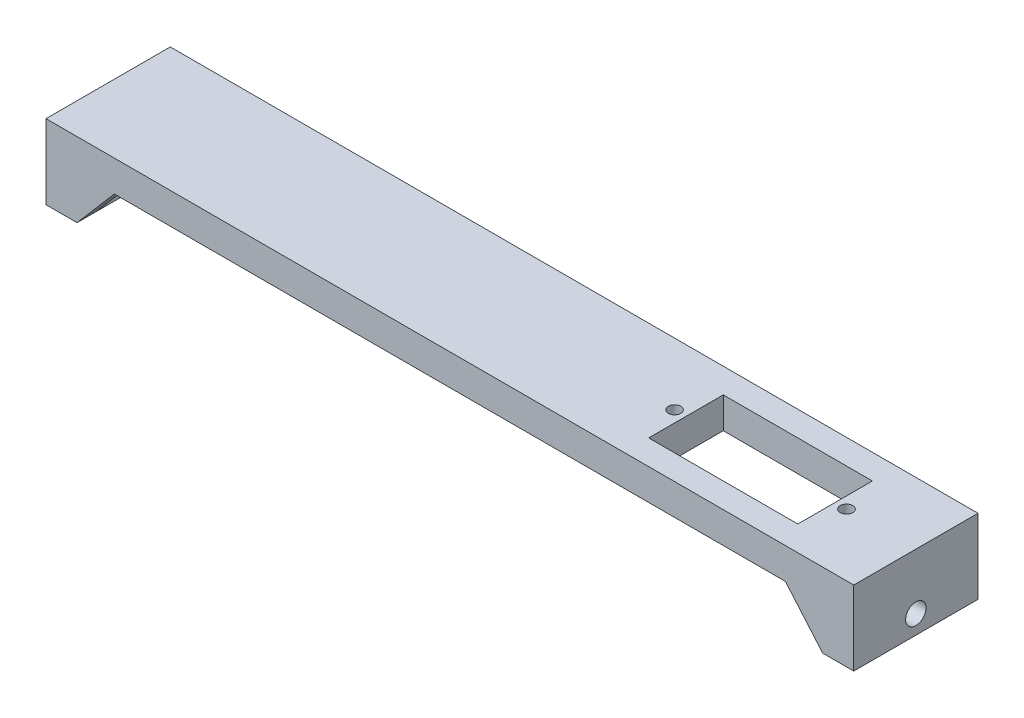
ISO-10303-21;
HEADER;
FILE_DESCRIPTION(('STEP AP214'),'2;1');
FILE_NAME('part.step','',(''),(''),'','','');
FILE_SCHEMA(('AUTOMOTIVE_DESIGN { 1 0 10303 214 1 1 1 1 }'));
ENDSEC;
DATA;
#1=APPLICATION_CONTEXT('core data for automotive mechanical design processes');
#2=APPLICATION_PROTOCOL_DEFINITION('international standard','automotive_design',2000,#1);
#3=PRODUCT_CONTEXT('',#1,'mechanical');
#4=PRODUCT('Part','Part','',(#3));
#5=PRODUCT_RELATED_PRODUCT_CATEGORY('part','',(#4));
#6=PRODUCT_DEFINITION_FORMATION('','',#4);
#7=PRODUCT_DEFINITION_CONTEXT('part definition',#1,'design');
#8=PRODUCT_DEFINITION('design','',#6,#7);
#9=PRODUCT_DEFINITION_SHAPE('','',#8);
#10=(LENGTH_UNIT() NAMED_UNIT(*) SI_UNIT(.MILLI.,.METRE.));
#11=(NAMED_UNIT(*) PLANE_ANGLE_UNIT() SI_UNIT($,.RADIAN.));
#12=(NAMED_UNIT(*) SI_UNIT($,.STERADIAN.) SOLID_ANGLE_UNIT());
#13=UNCERTAINTY_MEASURE_WITH_UNIT(LENGTH_MEASURE(1.E-05),#10,'distance_accuracy_value','');
#14=(GEOMETRIC_REPRESENTATION_CONTEXT(3) GLOBAL_UNCERTAINTY_ASSIGNED_CONTEXT((#13)) GLOBAL_UNIT_ASSIGNED_CONTEXT((#10,
#11,#12)) REPRESENTATION_CONTEXT('',''));
#15=CARTESIAN_POINT('',(0.,0.,0.));
#16=DIRECTION('',(0.,0.,1.));
#17=DIRECTION('',(1.,0.,0.));
#18=AXIS2_PLACEMENT_3D('',#15,#16,#17);
#19=CARTESIAN_POINT('',(60.,-5.00000000000001,20.));
#20=DIRECTION('',(0.,1.,0.));
#21=DIRECTION('',(0.,0.,1.));
#22=AXIS2_PLACEMENT_3D('',#19,#20,#21);
#23=PLANE('',#22);
#24=CARTESIAN_POINT('',(53.835,-5.00000000000001,10.));
#25=DIRECTION('',(0.,-1.,0.));
#26=DIRECTION('',(0.,0.,-1.));
#27=AXIS2_PLACEMENT_3D('',#24,#25,#26);
#28=CIRCLE('',#27,0.999999999999998);
#29=CARTESIAN_POINT('',(53.835,-5.00000000000001,9.));
#30=VERTEX_POINT('',#29);
#31=EDGE_CURVE('E679',#30,#30,#28,.T.);
#32=ORIENTED_EDGE('',*,*,#31,.F.);
#33=EDGE_LOOP('',(#32));
#34=FACE_BOUND('',#33,.T.);
#35=CARTESIAN_POINT('',(26.165,-5.00000000000001,10.));
#36=DIRECTION('',(0.,-1.,0.));
#37=DIRECTION('',(0.,0.,-1.));
#38=AXIS2_PLACEMENT_3D('',#35,#36,#37);
#39=CIRCLE('',#38,1.);
#40=CARTESIAN_POINT('',(26.165,-5.00000000000001,8.99999999999999));
#41=VERTEX_POINT('',#40);
#42=EDGE_CURVE('E193',#41,#41,#39,.T.);
#43=ORIENTED_EDGE('',*,*,#42,.F.);
#44=EDGE_LOOP('',(#43));
#45=FACE_BOUND('',#44,.T.);
#46=DIRECTION('',(-1.,0.,0.));
#47=VECTOR('',#46,1.);
#48=CARTESIAN_POINT('',(52.,-5.00000000000001,16.));
#49=LINE('',#48,#47);
#50=CARTESIAN_POINT('',(52.,-5.00000000000001,16.));
#51=VERTEX_POINT('',#50);
#52=CARTESIAN_POINT('',(28.,-5.00000000000001,16.));
#53=VERTEX_POINT('',#52);
#54=EDGE_CURVE('E202',#51,#53,#49,.T.);
#55=ORIENTED_EDGE('',*,*,#54,.F.);
#56=DIRECTION('',(0.,0.,1.));
#57=VECTOR('',#56,1.);
#58=CARTESIAN_POINT('',(52.,-5.00000000000001,4.));
#59=LINE('',#58,#57);
#60=CARTESIAN_POINT('',(52.,-5.00000000000001,4.));
#61=VERTEX_POINT('',#60);
#62=EDGE_CURVE('E57',#61,#51,#59,.T.);
#63=ORIENTED_EDGE('',*,*,#62,.F.);
#64=DIRECTION('',(-1.,0.,0.));
#65=VECTOR('',#64,1.);
#66=CARTESIAN_POINT('',(52.,-5.00000000000001,4.));
#67=LINE('',#66,#65);
#68=CARTESIAN_POINT('',(28.,-5.00000000000001,4.));
#69=VERTEX_POINT('',#68);
#70=EDGE_CURVE('E186',#61,#69,#67,.T.);
#71=ORIENTED_EDGE('',*,*,#70,.T.);
#72=DIRECTION('',(0.,0.,1.));
#73=VECTOR('',#72,1.);
#74=CARTESIAN_POINT('',(28.,-5.00000000000001,4.));
#75=LINE('',#74,#73);
#76=EDGE_CURVE('E190',#69,#53,#75,.T.);
#77=ORIENTED_EDGE('',*,*,#76,.T.);
#78=EDGE_LOOP('',(#55,#63,#71,#77));
#79=FACE_BOUND('',#78,.T.);
#80=DIRECTION('',(-1.,0.,0.));
#81=VECTOR('',#80,1.);
#82=CARTESIAN_POINT('',(54.,-5.00000000000001,17.));
#83=LINE('',#82,#81);
#84=CARTESIAN_POINT('',(60.,-5.00000000000001,17.));
#85=VERTEX_POINT('',#84);
#86=CARTESIAN_POINT('',(54.,-5.00000000000001,17.));
#87=VERTEX_POINT('',#86);
#88=EDGE_CURVE('E218',#85,#87,#83,.T.);
#89=ORIENTED_EDGE('',*,*,#88,.T.);
#90=DIRECTION('',(0.,0.,1.));
#91=VECTOR('',#90,1.);
#92=CARTESIAN_POINT('',(54.,-5.00000000000001,17.));
#93=LINE('',#92,#91);
#94=CARTESIAN_POINT('',(54.,-5.00000000000001,20.));
#95=VERTEX_POINT('',#94);
#96=EDGE_CURVE('E229',#87,#95,#93,.T.);
#97=ORIENTED_EDGE('',*,*,#96,.T.);
#98=DIRECTION('',(1.,0.,0.));
#99=VECTOR('',#98,1.);
#100=CARTESIAN_POINT('',(60.,-5.00000000000001,20.));
#101=LINE('',#100,#99);
#102=CARTESIAN_POINT('',(-54.,-5.00000000000001,20.));
#103=VERTEX_POINT('',#102);
#104=EDGE_CURVE('E324',#103,#95,#101,.T.);
#105=ORIENTED_EDGE('',*,*,#104,.F.);
#106=DIRECTION('',(0.,0.,1.));
#107=VECTOR('',#106,1.);
#108=CARTESIAN_POINT('',(-54.,-5.00000000000001,17.));
#109=LINE('',#108,#107);
#110=CARTESIAN_POINT('',(-54.,-5.00000000000001,17.));
#111=VERTEX_POINT('',#110);
#112=EDGE_CURVE('E270',#111,#103,#109,.T.);
#113=ORIENTED_EDGE('',*,*,#112,.F.);
#114=DIRECTION('',(1.,0.,0.));
#115=VECTOR('',#114,1.);
#116=CARTESIAN_POINT('',(-54.,-5.00000000000001,17.));
#117=LINE('',#116,#115);
#118=CARTESIAN_POINT('',(-60.,-5.00000000000001,17.));
#119=VERTEX_POINT('',#118);
#120=EDGE_CURVE('E260',#119,#111,#117,.T.);
#121=ORIENTED_EDGE('',*,*,#120,.F.);
#122=DIRECTION('',(0.,0.,-1.));
#123=VECTOR('',#122,1.);
#124=CARTESIAN_POINT('',(-60.,-5.00000000000001,20.));
#125=LINE('',#124,#123);
#126=CARTESIAN_POINT('',(-60.,-5.00000000000001,3.));
#127=VERTEX_POINT('',#126);
#128=EDGE_CURVE('E374',#119,#127,#125,.T.);
#129=ORIENTED_EDGE('',*,*,#128,.T.);
#130=DIRECTION('',(1.,0.,0.));
#131=VECTOR('',#130,1.);
#132=CARTESIAN_POINT('',(-54.,-5.00000000000001,3.));
#133=LINE('',#132,#131);
#134=CARTESIAN_POINT('',(-54.,-5.00000000000001,3.));
#135=VERTEX_POINT('',#134);
#136=EDGE_CURVE('E277',#127,#135,#133,.T.);
#137=ORIENTED_EDGE('',*,*,#136,.T.);
#138=DIRECTION('',(0.,0.,-1.));
#139=VECTOR('',#138,1.);
#140=CARTESIAN_POINT('',(-54.,-5.00000000000001,3.));
#141=LINE('',#140,#139);
#142=CARTESIAN_POINT('',(-54.,-5.,0.));
#143=VERTEX_POINT('',#142);
#144=EDGE_CURVE('E288',#135,#143,#141,.T.);
#145=ORIENTED_EDGE('',*,*,#144,.T.);
#146=DIRECTION('',(1.,0.,0.));
#147=VECTOR('',#146,1.);
#148=CARTESIAN_POINT('',(60.,-5.00000000000001,0.));
#149=LINE('',#148,#147);
#150=CARTESIAN_POINT('',(54.,-5.00000000000002,0.));
#151=VERTEX_POINT('',#150);
#152=EDGE_CURVE('E344',#143,#151,#149,.T.);
#153=ORIENTED_EDGE('',*,*,#152,.T.);
#154=DIRECTION('',(0.,0.,-1.));
#155=VECTOR('',#154,1.);
#156=CARTESIAN_POINT('',(54.,-5.00000000000001,3.));
#157=LINE('',#156,#155);
#158=CARTESIAN_POINT('',(54.,-5.00000000000001,3.));
#159=VERTEX_POINT('',#158);
#160=EDGE_CURVE('E252',#159,#151,#157,.T.);
#161=ORIENTED_EDGE('',*,*,#160,.F.);
#162=DIRECTION('',(-1.,0.,0.));
#163=VECTOR('',#162,1.);
#164=CARTESIAN_POINT('',(54.,-5.00000000000001,3.));
#165=LINE('',#164,#163);
#166=CARTESIAN_POINT('',(60.,-5.00000000000001,3.));
#167=VERTEX_POINT('',#166);
#168=EDGE_CURVE('E236',#167,#159,#165,.T.);
#169=ORIENTED_EDGE('',*,*,#168,.F.);
#170=DIRECTION('',(0.,0.,-1.));
#171=VECTOR('',#170,1.);
#172=CARTESIAN_POINT('',(60.,-5.00000000000001,20.));
#173=LINE('',#172,#171);
#174=EDGE_CURVE('E371',#85,#167,#173,.T.);
#175=ORIENTED_EDGE('',*,*,#174,.F.);
#176=EDGE_LOOP('',(#89,#97,#105,#113,#121,#129,#137,#145,#153,#161,#169,#175));
#177=FACE_BOUND('',#176,.T.);
#178=ADVANCED_FACE('F41',(#34,#45,#79,#177),#23,.F.);
#179=CARTESIAN_POINT('',(-65.,-12.,20.));
#180=DIRECTION('',(1.,0.,0.));
#181=DIRECTION('',(0.,0.,-1.));
#182=AXIS2_PLACEMENT_3D('',#179,#180,#181);
#183=PLANE('',#182);
#184=CARTESIAN_POINT('',(-65.,-8.99999999999999,10.));
#185=DIRECTION('',(1.,0.,0.));
#186=DIRECTION('',(0.,1.,0.));
#187=AXIS2_PLACEMENT_3D('',#184,#185,#186);
#188=CIRCLE('',#187,1.65);
#189=CARTESIAN_POINT('',(-65.,-7.34999999999999,10.));
#190=VERTEX_POINT('',#189);
#191=EDGE_CURVE('E302',#190,#190,#188,.T.);
#192=ORIENTED_EDGE('',*,*,#191,.T.);
#193=EDGE_LOOP('',(#192));
#194=FACE_BOUND('',#193,.T.);
#195=DIRECTION('',(0.,-1.,0.));
#196=VECTOR('',#195,1.);
#197=CARTESIAN_POINT('',(-65.,-12.,0.));
#198=LINE('',#197,#196);
#199=CARTESIAN_POINT('',(-65.,0.,0.));
#200=VERTEX_POINT('',#199);
#201=CARTESIAN_POINT('',(-65.,-12.,0.));
#202=VERTEX_POINT('',#201);
#203=EDGE_CURVE('E314',#200,#202,#198,.T.);
#204=ORIENTED_EDGE('',*,*,#203,.T.);
#205=DIRECTION('',(0.,0.,-1.));
#206=VECTOR('',#205,1.);
#207=CARTESIAN_POINT('',(-65.,-12.,20.));
#208=LINE('',#207,#206);
#209=CARTESIAN_POINT('',(-65.,-12.,20.));
#210=VERTEX_POINT('',#209);
#211=EDGE_CURVE('E11',#210,#202,#208,.T.);
#212=ORIENTED_EDGE('',*,*,#211,.F.);
#213=DIRECTION('',(0.,-1.,0.));
#214=VECTOR('',#213,1.);
#215=CARTESIAN_POINT('',(-65.,-12.,20.));
#216=LINE('',#215,#214);
#217=CARTESIAN_POINT('',(-65.,0.,20.));
#218=VERTEX_POINT('',#217);
#219=EDGE_CURVE('E315',#218,#210,#216,.T.);
#220=ORIENTED_EDGE('',*,*,#219,.F.);
#221=DIRECTION('',(0.,0.,-1.));
#222=VECTOR('',#221,1.);
#223=CARTESIAN_POINT('',(-65.,0.,20.));
#224=LINE('',#223,#222);
#225=EDGE_CURVE('E337',#218,#200,#224,.T.);
#226=ORIENTED_EDGE('',*,*,#225,.T.);
#227=EDGE_LOOP('',(#204,#212,#220,#226));
#228=FACE_BOUND('',#227,.T.);
#229=ADVANCED_FACE('F43',(#194,#228),#183,.F.);
#230=CARTESIAN_POINT('',(-60.,-12.,20.));
#231=DIRECTION('',(0.,1.,0.));
#232=DIRECTION('',(-1.,0.,0.));
#233=AXIS2_PLACEMENT_3D('',#230,#231,#232);
#234=PLANE('',#233);
#235=DIRECTION('',(1.,0.,0.));
#236=VECTOR('',#235,1.);
#237=CARTESIAN_POINT('',(-60.,-12.,0.));
#238=LINE('',#237,#236);
#239=CARTESIAN_POINT('',(-60.,-12.,0.));
#240=VERTEX_POINT('',#239);
#241=EDGE_CURVE('E341',#202,#240,#238,.T.);
#242=ORIENTED_EDGE('',*,*,#241,.T.);
#243=DIRECTION('',(0.,0.,-1.));
#244=VECTOR('',#243,1.);
#245=CARTESIAN_POINT('',(-60.,-12.,3.));
#246=LINE('',#245,#244);
#247=CARTESIAN_POINT('',(-60.,-12.,3.));
#248=VERTEX_POINT('',#247);
#249=EDGE_CURVE('E292',#248,#240,#246,.T.);
#250=ORIENTED_EDGE('',*,*,#249,.F.);
#251=DIRECTION('',(0.,0.,-1.));
#252=VECTOR('',#251,1.);
#253=CARTESIAN_POINT('',(-60.,-12.,20.));
#254=LINE('',#253,#252);
#255=CARTESIAN_POINT('',(-60.,-12.,17.));
#256=VERTEX_POINT('',#255);
#257=EDGE_CURVE('E376',#256,#248,#254,.T.);
#258=ORIENTED_EDGE('',*,*,#257,.F.);
#259=CARTESIAN_POINT('',(-60.,-12.,20.));
#260=VERTEX_POINT('',#259);
#261=EDGE_CURVE('E50',#260,#256,#254,.T.);
#262=ORIENTED_EDGE('',*,*,#261,.F.);
#263=DIRECTION('',(1.,0.,0.));
#264=VECTOR('',#263,1.);
#265=CARTESIAN_POINT('',(-60.,-12.,20.));
#266=LINE('',#265,#264);
#267=EDGE_CURVE('E319',#210,#260,#266,.T.);
#268=ORIENTED_EDGE('',*,*,#267,.F.);
#269=ORIENTED_EDGE('',*,*,#211,.T.);
#270=EDGE_LOOP('',(#242,#250,#258,#262,#268,#269));
#271=FACE_BOUND('',#270,.T.);
#272=ADVANCED_FACE('F391',(#271),#234,.F.);
#273=CARTESIAN_POINT('',(-60.,-5.00000000000001,20.));
#274=DIRECTION('',(-1.,0.,0.));
#275=DIRECTION('',(0.,-1.,0.));
#276=AXIS2_PLACEMENT_3D('',#273,#274,#275);
#277=PLANE('',#276);
#278=CARTESIAN_POINT('',(-60.,-9.,10.));
#279=DIRECTION('',(-1.,0.,0.));
#280=DIRECTION('',(0.,-1.,0.));
#281=AXIS2_PLACEMENT_3D('',#278,#279,#280);
#282=CIRCLE('',#281,1.65);
#283=CARTESIAN_POINT('',(-60.,-10.65,10.));
#284=VERTEX_POINT('',#283);
#285=EDGE_CURVE('E310',#284,#284,#282,.T.);
#286=ORIENTED_EDGE('',*,*,#285,.T.);
#287=EDGE_LOOP('',(#286));
#288=FACE_BOUND('',#287,.T.);
#289=ORIENTED_EDGE('',*,*,#128,.F.);
#290=DIRECTION('',(0.,1.,0.));
#291=VECTOR('',#290,1.);
#292=CARTESIAN_POINT('',(-60.,-5.00000000000001,17.));
#293=LINE('',#292,#291);
#294=EDGE_CURVE('E264',#256,#119,#293,.T.);
#295=ORIENTED_EDGE('',*,*,#294,.F.);
#296=ORIENTED_EDGE('',*,*,#257,.T.);
#297=DIRECTION('',(0.,1.,0.));
#298=VECTOR('',#297,1.);
#299=CARTESIAN_POINT('',(-60.,-5.00000000000001,3.));
#300=LINE('',#299,#298);
#301=EDGE_CURVE('E284',#248,#127,#300,.T.);
#302=ORIENTED_EDGE('',*,*,#301,.T.);
#303=EDGE_LOOP('',(#289,#295,#296,#302));
#304=FACE_BOUND('',#303,.T.);
#305=ADVANCED_FACE('F387',(#288,#304),#277,.F.);
#306=CARTESIAN_POINT('',(60.,-12.,20.));
#307=DIRECTION('',(1.,0.,0.));
#308=DIRECTION('',(0.,1.,0.));
#309=AXIS2_PLACEMENT_3D('',#306,#307,#308);
#310=PLANE('',#309);
#311=CARTESIAN_POINT('',(60.,-9.00000000000007,10.));
#312=DIRECTION('',(1.,0.,0.));
#313=DIRECTION('',(0.,1.,0.));
#314=AXIS2_PLACEMENT_3D('',#311,#312,#313);
#315=CIRCLE('',#314,1.65);
#316=CARTESIAN_POINT('',(60.,-7.35000000000007,10.));
#317=VERTEX_POINT('',#316);
#318=EDGE_CURVE('E306',#317,#317,#315,.T.);
#319=ORIENTED_EDGE('',*,*,#318,.T.);
#320=EDGE_LOOP('',(#319));
#321=FACE_BOUND('',#320,.T.);
#322=DIRECTION('',(0.,0.,-1.));
#323=VECTOR('',#322,1.);
#324=CARTESIAN_POINT('',(60.,-12.,20.));
#325=LINE('',#324,#323);
#326=CARTESIAN_POINT('',(60.,-12.,17.));
#327=VERTEX_POINT('',#326);
#328=CARTESIAN_POINT('',(60.,-12.,3.));
#329=VERTEX_POINT('',#328);
#330=EDGE_CURVE('E366',#327,#329,#325,.T.);
#331=ORIENTED_EDGE('',*,*,#330,.F.);
#332=DIRECTION('',(0.,1.,0.));
#333=VECTOR('',#332,1.);
#334=CARTESIAN_POINT('',(60.,-5.00000000000001,17.));
#335=LINE('',#334,#333);
#336=EDGE_CURVE('E225',#327,#85,#335,.T.);
#337=ORIENTED_EDGE('',*,*,#336,.T.);
#338=ORIENTED_EDGE('',*,*,#174,.T.);
#339=DIRECTION('',(0.,1.,0.));
#340=VECTOR('',#339,1.);
#341=CARTESIAN_POINT('',(60.,-5.00000000000001,3.));
#342=LINE('',#341,#340);
#343=EDGE_CURVE('E240',#329,#167,#342,.T.);
#344=ORIENTED_EDGE('',*,*,#343,.F.);
#345=EDGE_LOOP('',(#331,#337,#338,#344));
#346=FACE_BOUND('',#345,.T.);
#347=ADVANCED_FACE('F431',(#321,#346),#310,.F.);
#348=CARTESIAN_POINT('',(65.,-12.,20.));
#349=DIRECTION('',(0.,1.,0.));
#350=DIRECTION('',(0.,0.,1.));
#351=AXIS2_PLACEMENT_3D('',#348,#349,#350);
#352=PLANE('',#351);
#353=DIRECTION('',(1.,0.,0.));
#354=VECTOR('',#353,1.);
#355=CARTESIAN_POINT('',(65.,-12.,0.));
#356=LINE('',#355,#354);
#357=CARTESIAN_POINT('',(60.,-12.,0.));
#358=VERTEX_POINT('',#357);
#359=CARTESIAN_POINT('',(65.,-12.,0.));
#360=VERTEX_POINT('',#359);
#361=EDGE_CURVE('E347',#358,#360,#356,.T.);
#362=ORIENTED_EDGE('',*,*,#361,.T.);
#363=DIRECTION('',(0.,0.,-1.));
#364=VECTOR('',#363,1.);
#365=CARTESIAN_POINT('',(65.,-12.,20.));
#366=LINE('',#365,#364);
#367=CARTESIAN_POINT('',(65.,-12.,20.));
#368=VERTEX_POINT('',#367);
#369=EDGE_CURVE('E362',#368,#360,#366,.T.);
#370=ORIENTED_EDGE('',*,*,#369,.F.);
#371=DIRECTION('',(1.,0.,0.));
#372=VECTOR('',#371,1.);
#373=CARTESIAN_POINT('',(65.,-12.,20.));
#374=LINE('',#373,#372);
#375=CARTESIAN_POINT('',(60.,-12.,20.));
#376=VERTEX_POINT('',#375);
#377=EDGE_CURVE('E328',#376,#368,#374,.T.);
#378=ORIENTED_EDGE('',*,*,#377,.F.);
#379=EDGE_CURVE('E367',#376,#327,#325,.T.);
#380=ORIENTED_EDGE('',*,*,#379,.T.);
#381=ORIENTED_EDGE('',*,*,#330,.T.);
#382=DIRECTION('',(0.,0.,-1.));
#383=VECTOR('',#382,1.);
#384=CARTESIAN_POINT('',(60.,-12.,3.));
#385=LINE('',#384,#383);
#386=EDGE_CURVE('E248',#329,#358,#385,.T.);
#387=ORIENTED_EDGE('',*,*,#386,.T.);
#388=EDGE_LOOP('',(#362,#370,#378,#380,#381,#387));
#389=FACE_BOUND('',#388,.T.);
#390=ADVANCED_FACE('F441',(#389),#352,.F.);
#391=CARTESIAN_POINT('',(65.,0.,20.));
#392=DIRECTION('',(-1.,0.,0.));
#393=DIRECTION('',(0.,0.,1.));
#394=AXIS2_PLACEMENT_3D('',#391,#392,#393);
#395=PLANE('',#394);
#396=CARTESIAN_POINT('',(65.,-9.00000000000007,10.));
#397=DIRECTION('',(1.,0.,0.));
#398=DIRECTION('',(0.,1.,0.));
#399=AXIS2_PLACEMENT_3D('',#396,#397,#398);
#400=CIRCLE('',#399,1.65);
#401=CARTESIAN_POINT('',(65.,-7.35000000000007,10.));
#402=VERTEX_POINT('',#401);
#403=EDGE_CURVE('E296',#402,#402,#400,.T.);
#404=ORIENTED_EDGE('',*,*,#403,.F.);
#405=EDGE_LOOP('',(#404));
#406=FACE_BOUND('',#405,.T.);
#407=DIRECTION('',(0.,1.,0.));
#408=VECTOR('',#407,1.);
#409=CARTESIAN_POINT('',(65.,0.,0.));
#410=LINE('',#409,#408);
#411=CARTESIAN_POINT('',(65.,0.,0.));
#412=VERTEX_POINT('',#411);
#413=EDGE_CURVE('E350',#360,#412,#410,.T.);
#414=ORIENTED_EDGE('',*,*,#413,.T.);
#415=DIRECTION('',(0.,0.,-1.));
#416=VECTOR('',#415,1.);
#417=CARTESIAN_POINT('',(65.,0.,20.));
#418=LINE('',#417,#416);
#419=CARTESIAN_POINT('',(65.,0.,20.));
#420=VERTEX_POINT('',#419);
#421=EDGE_CURVE('E358',#420,#412,#418,.T.);
#422=ORIENTED_EDGE('',*,*,#421,.F.);
#423=DIRECTION('',(0.,1.,0.));
#424=VECTOR('',#423,1.);
#425=CARTESIAN_POINT('',(65.,0.,20.));
#426=LINE('',#425,#424);
#427=EDGE_CURVE('E331',#368,#420,#426,.T.);
#428=ORIENTED_EDGE('',*,*,#427,.F.);
#429=ORIENTED_EDGE('',*,*,#369,.T.);
#430=EDGE_LOOP('',(#414,#422,#428,#429));
#431=FACE_BOUND('',#430,.T.);
#432=ADVANCED_FACE('F446',(#406,#431),#395,.F.);
#433=CARTESIAN_POINT('',(-65.,0.,20.));
#434=DIRECTION('',(0.,-1.,0.));
#435=DIRECTION('',(0.,0.,-1.));
#436=AXIS2_PLACEMENT_3D('',#433,#434,#435);
#437=PLANE('',#436);
#438=CARTESIAN_POINT('',(53.835,0.,10.));
#439=DIRECTION('',(0.,-1.,0.));
#440=DIRECTION('',(0.,0.,-1.));
#441=AXIS2_PLACEMENT_3D('',#438,#439,#440);
#442=CIRCLE('',#441,0.999999999999998);
#443=CARTESIAN_POINT('',(53.835,0.,9.));
#444=VERTEX_POINT('',#443);
#445=EDGE_CURVE('E203',#444,#444,#442,.T.);
#446=ORIENTED_EDGE('',*,*,#445,.T.);
#447=EDGE_LOOP('',(#446));
#448=FACE_BOUND('',#447,.T.);
#449=CARTESIAN_POINT('',(26.165,0.,10.));
#450=DIRECTION('',(0.,-1.,0.));
#451=DIRECTION('',(0.,0.,-1.));
#452=AXIS2_PLACEMENT_3D('',#449,#450,#451);
#453=CIRCLE('',#452,1.);
#454=CARTESIAN_POINT('',(26.165,0.,8.99999999999999));
#455=VERTEX_POINT('',#454);
#456=EDGE_CURVE('E681',#455,#455,#453,.T.);
#457=ORIENTED_EDGE('',*,*,#456,.T.);
#458=EDGE_LOOP('',(#457));
#459=FACE_BOUND('',#458,.T.);
#460=DIRECTION('',(-1.,0.,0.));
#461=VECTOR('',#460,1.);
#462=CARTESIAN_POINT('',(52.,0.,4.));
#463=LINE('',#462,#461);
#464=CARTESIAN_POINT('',(52.,0.,4.));
#465=VERTEX_POINT('',#464);
#466=CARTESIAN_POINT('',(28.,0.,4.));
#467=VERTEX_POINT('',#466);
#468=EDGE_CURVE('E173',#465,#467,#463,.T.);
#469=ORIENTED_EDGE('',*,*,#468,.F.);
#470=DIRECTION('',(0.,0.,1.));
#471=VECTOR('',#470,1.);
#472=CARTESIAN_POINT('',(52.,0.,4.));
#473=LINE('',#472,#471);
#474=CARTESIAN_POINT('',(52.,0.,16.));
#475=VERTEX_POINT('',#474);
#476=EDGE_CURVE('E169',#465,#475,#473,.T.);
#477=ORIENTED_EDGE('',*,*,#476,.T.);
#478=DIRECTION('',(-1.,0.,0.));
#479=VECTOR('',#478,1.);
#480=CARTESIAN_POINT('',(52.,0.,16.));
#481=LINE('',#480,#479);
#482=CARTESIAN_POINT('',(28.,0.,16.));
#483=VERTEX_POINT('',#482);
#484=EDGE_CURVE('E176',#475,#483,#481,.T.);
#485=ORIENTED_EDGE('',*,*,#484,.T.);
#486=DIRECTION('',(0.,0.,1.));
#487=VECTOR('',#486,1.);
#488=CARTESIAN_POINT('',(28.,0.,4.));
#489=LINE('',#488,#487);
#490=EDGE_CURVE('E181',#467,#483,#489,.T.);
#491=ORIENTED_EDGE('',*,*,#490,.F.);
#492=EDGE_LOOP('',(#469,#477,#485,#491));
#493=FACE_BOUND('',#492,.T.);
#494=DIRECTION('',(-1.,0.,0.));
#495=VECTOR('',#494,1.);
#496=CARTESIAN_POINT('',(-65.,0.,0.));
#497=LINE('',#496,#495);
#498=EDGE_CURVE('E320',#412,#200,#497,.T.);
#499=ORIENTED_EDGE('',*,*,#498,.T.);
#500=ORIENTED_EDGE('',*,*,#225,.F.);
#501=DIRECTION('',(-1.,0.,0.));
#502=VECTOR('',#501,1.);
#503=CARTESIAN_POINT('',(-65.,0.,20.));
#504=LINE('',#503,#502);
#505=EDGE_CURVE('E334',#420,#218,#504,.T.);
#506=ORIENTED_EDGE('',*,*,#505,.F.);
#507=ORIENTED_EDGE('',*,*,#421,.T.);
#508=EDGE_LOOP('',(#499,#500,#506,#507));
#509=FACE_BOUND('',#508,.T.);
#510=ADVANCED_FACE('F183',(#448,#459,#493,#509),#437,.F.);
#511=CARTESIAN_POINT('',(0.,0.,20.));
#512=DIRECTION('',(0.,0.,-1.));
#513=DIRECTION('',(-1.,0.,0.));
#514=AXIS2_PLACEMENT_3D('',#511,#512,#513);
#515=PLANE('',#514);
#516=ORIENTED_EDGE('',*,*,#104,.T.);
#517=DIRECTION('',(0.65079137345597,-0.759256602365296,0.));
#518=VECTOR('',#517,1.);
#519=CARTESIAN_POINT('',(54.,-5.00000000000001,20.));
#520=LINE('',#519,#518);
#521=EDGE_CURVE('E212',#95,#376,#520,.T.);
#522=ORIENTED_EDGE('',*,*,#521,.T.);
#523=ORIENTED_EDGE('',*,*,#377,.T.);
#524=ORIENTED_EDGE('',*,*,#427,.T.);
#525=ORIENTED_EDGE('',*,*,#505,.T.);
#526=ORIENTED_EDGE('',*,*,#219,.T.);
#527=ORIENTED_EDGE('',*,*,#267,.T.);
#528=DIRECTION('',(-0.65079137345597,-0.759256602365296,0.));
#529=VECTOR('',#528,1.);
#530=CARTESIAN_POINT('',(-54.,-5.00000000000001,20.));
#531=LINE('',#530,#529);
#532=EDGE_CURVE('E256',#103,#260,#531,.T.);
#533=ORIENTED_EDGE('',*,*,#532,.F.);
#534=EDGE_LOOP('',(#516,#522,#523,#524,#525,#526,#527,#533));
#535=FACE_BOUND('',#534,.T.);
#536=ADVANCED_FACE('F408',(#535),#515,.F.);
#537=CARTESIAN_POINT('',(0.,0.,0.));
#538=DIRECTION('',(0.,0.,-1.));
#539=DIRECTION('',(-1.,0.,0.));
#540=AXIS2_PLACEMENT_3D('',#537,#538,#539);
#541=PLANE('',#540);
#542=DIRECTION('',(0.65079137345597,-0.759256602365296,0.));
#543=VECTOR('',#542,1.);
#544=CARTESIAN_POINT('',(54.,-5.00000000000001,0.));
#545=LINE('',#544,#543);
#546=EDGE_CURVE('E235',#151,#358,#545,.T.);
#547=ORIENTED_EDGE('',*,*,#546,.F.);
#548=ORIENTED_EDGE('',*,*,#152,.F.);
#549=DIRECTION('',(-0.65079137345597,-0.759256602365296,0.));
#550=VECTOR('',#549,1.);
#551=CARTESIAN_POINT('',(-54.,-5.00000000000001,0.));
#552=LINE('',#551,#550);
#553=EDGE_CURVE('E276',#143,#240,#552,.T.);
#554=ORIENTED_EDGE('',*,*,#553,.T.);
#555=ORIENTED_EDGE('',*,*,#241,.F.);
#556=ORIENTED_EDGE('',*,*,#203,.F.);
#557=ORIENTED_EDGE('',*,*,#498,.F.);
#558=ORIENTED_EDGE('',*,*,#413,.F.);
#559=ORIENTED_EDGE('',*,*,#361,.F.);
#560=EDGE_LOOP('',(#547,#548,#554,#555,#556,#557,#558,#559));
#561=FACE_BOUND('',#560,.T.);
#562=ADVANCED_FACE('F418',(#561),#541,.T.);
#563=CARTESIAN_POINT('',(-65.,-8.99999999999999,10.));
#564=DIRECTION('',(1.,0.,0.));
#565=DIRECTION('',(0.,1.,0.));
#566=AXIS2_PLACEMENT_3D('',#563,#564,#565);
#567=CYLINDRICAL_SURFACE('',#566,1.65);
#568=ORIENTED_EDGE('',*,*,#403,.T.);
#569=EDGE_LOOP('',(#568));
#570=FACE_BOUND('',#569,.T.);
#571=ORIENTED_EDGE('',*,*,#318,.F.);
#572=EDGE_LOOP('',(#571));
#573=FACE_BOUND('',#572,.T.);
#574=ADVANCED_FACE('F510',(#570,#573),#567,.F.);
#575=ORIENTED_EDGE('',*,*,#191,.F.);
#576=EDGE_LOOP('',(#575));
#577=FACE_BOUND('',#576,.T.);
#578=ORIENTED_EDGE('',*,*,#285,.F.);
#579=EDGE_LOOP('',(#578));
#580=FACE_BOUND('',#579,.T.);
#581=ADVANCED_FACE('F515',(#577,#580),#567,.F.);
#582=CARTESIAN_POINT('',(-54.,-5.00000000000001,3.));
#583=DIRECTION('',(0.759256602365296,-0.650791373455969,0.));
#584=DIRECTION('',(0.65079137345597,0.759256602365296,0.));
#585=AXIS2_PLACEMENT_3D('',#582,#583,#584);
#586=PLANE('',#585);
#587=ORIENTED_EDGE('',*,*,#553,.F.);
#588=ORIENTED_EDGE('',*,*,#144,.F.);
#589=DIRECTION('',(-0.65079137345597,-0.759256602365296,0.));
#590=VECTOR('',#589,1.);
#591=CARTESIAN_POINT('',(-54.,-5.00000000000001,3.));
#592=LINE('',#591,#590);
#593=EDGE_CURVE('E280',#135,#248,#592,.T.);
#594=ORIENTED_EDGE('',*,*,#593,.T.);
#595=ORIENTED_EDGE('',*,*,#249,.T.);
#596=EDGE_LOOP('',(#587,#588,#594,#595));
#597=FACE_BOUND('',#596,.T.);
#598=ADVANCED_FACE('F396',(#597),#586,.T.);
#599=CARTESIAN_POINT('',(0.,0.,3.));
#600=DIRECTION('',(0.,0.,1.));
#601=DIRECTION('',(1.,0.,0.));
#602=AXIS2_PLACEMENT_3D('',#599,#600,#601);
#603=PLANE('',#602);
#604=ORIENTED_EDGE('',*,*,#136,.F.);
#605=ORIENTED_EDGE('',*,*,#301,.F.);
#606=ORIENTED_EDGE('',*,*,#593,.F.);
#607=EDGE_LOOP('',(#604,#605,#606));
#608=FACE_BOUND('',#607,.T.);
#609=ADVANCED_FACE('F398',(#608),#603,.T.);
#610=CARTESIAN_POINT('',(-54.,-5.00000000000001,17.));
#611=DIRECTION('',(-0.759256602365296,0.650791373455969,0.));
#612=DIRECTION('',(-0.65079137345597,-0.759256602365296,0.));
#613=AXIS2_PLACEMENT_3D('',#610,#611,#612);
#614=PLANE('',#613);
#615=ORIENTED_EDGE('',*,*,#532,.T.);
#616=ORIENTED_EDGE('',*,*,#261,.T.);
#617=DIRECTION('',(-0.65079137345597,-0.759256602365296,0.));
#618=VECTOR('',#617,1.);
#619=CARTESIAN_POINT('',(-54.,-5.00000000000001,17.));
#620=LINE('',#619,#618);
#621=EDGE_CURVE('E267',#111,#256,#620,.T.);
#622=ORIENTED_EDGE('',*,*,#621,.F.);
#623=ORIENTED_EDGE('',*,*,#112,.T.);
#624=EDGE_LOOP('',(#615,#616,#622,#623));
#625=FACE_BOUND('',#624,.T.);
#626=ADVANCED_FACE('F406',(#625),#614,.F.);
#627=CARTESIAN_POINT('',(0.,0.,17.));
#628=DIRECTION('',(0.,0.,-1.));
#629=DIRECTION('',(1.,0.,0.));
#630=AXIS2_PLACEMENT_3D('',#627,#628,#629);
#631=PLANE('',#630);
#632=ORIENTED_EDGE('',*,*,#120,.T.);
#633=ORIENTED_EDGE('',*,*,#621,.T.);
#634=ORIENTED_EDGE('',*,*,#294,.T.);
#635=EDGE_LOOP('',(#632,#633,#634));
#636=FACE_BOUND('',#635,.T.);
#637=ADVANCED_FACE('F405',(#636),#631,.T.);
#638=CARTESIAN_POINT('',(54.,-5.00000000000001,3.));
#639=DIRECTION('',(0.759256602365296,0.650791373455969,0.));
#640=DIRECTION('',(-0.65079137345597,0.759256602365296,0.));
#641=AXIS2_PLACEMENT_3D('',#638,#639,#640);
#642=PLANE('',#641);
#643=ORIENTED_EDGE('',*,*,#546,.T.);
#644=ORIENTED_EDGE('',*,*,#386,.F.);
#645=DIRECTION('',(0.65079137345597,-0.759256602365296,0.));
#646=VECTOR('',#645,1.);
#647=CARTESIAN_POINT('',(54.,-5.00000000000001,3.));
#648=LINE('',#647,#646);
#649=EDGE_CURVE('E244',#159,#329,#648,.T.);
#650=ORIENTED_EDGE('',*,*,#649,.F.);
#651=ORIENTED_EDGE('',*,*,#160,.T.);
#652=EDGE_LOOP('',(#643,#644,#650,#651));
#653=FACE_BOUND('',#652,.T.);
#654=ADVANCED_FACE('F425',(#653),#642,.F.);
#655=CARTESIAN_POINT('',(0.,0.,3.));
#656=DIRECTION('',(0.,0.,1.));
#657=DIRECTION('',(-1.,0.,0.));
#658=AXIS2_PLACEMENT_3D('',#655,#656,#657);
#659=PLANE('',#658);
#660=ORIENTED_EDGE('',*,*,#168,.T.);
#661=ORIENTED_EDGE('',*,*,#649,.T.);
#662=ORIENTED_EDGE('',*,*,#343,.T.);
#663=EDGE_LOOP('',(#660,#661,#662));
#664=FACE_BOUND('',#663,.T.);
#665=ADVANCED_FACE('F427',(#664),#659,.T.);
#666=CARTESIAN_POINT('',(54.,-5.00000000000001,17.));
#667=DIRECTION('',(-0.759256602365296,-0.650791373455969,0.));
#668=DIRECTION('',(0.65079137345597,-0.759256602365296,0.));
#669=AXIS2_PLACEMENT_3D('',#666,#667,#668);
#670=PLANE('',#669);
#671=ORIENTED_EDGE('',*,*,#521,.F.);
#672=ORIENTED_EDGE('',*,*,#96,.F.);
#673=DIRECTION('',(0.65079137345597,-0.759256602365296,0.));
#674=VECTOR('',#673,1.);
#675=CARTESIAN_POINT('',(54.,-5.00000000000001,17.));
#676=LINE('',#675,#674);
#677=EDGE_CURVE('E222',#87,#327,#676,.T.);
#678=ORIENTED_EDGE('',*,*,#677,.T.);
#679=ORIENTED_EDGE('',*,*,#379,.F.);
#680=EDGE_LOOP('',(#671,#672,#678,#679));
#681=FACE_BOUND('',#680,.T.);
#682=ADVANCED_FACE('F437',(#681),#670,.T.);
#683=CARTESIAN_POINT('',(0.,0.,17.));
#684=DIRECTION('',(0.,0.,-1.));
#685=DIRECTION('',(-1.,0.,0.));
#686=AXIS2_PLACEMENT_3D('',#683,#684,#685);
#687=PLANE('',#686);
#688=ORIENTED_EDGE('',*,*,#88,.F.);
#689=ORIENTED_EDGE('',*,*,#336,.F.);
#690=ORIENTED_EDGE('',*,*,#677,.F.);
#691=EDGE_LOOP('',(#688,#689,#690));
#692=FACE_BOUND('',#691,.T.);
#693=ADVANCED_FACE('F435',(#692),#687,.T.);
#694=CARTESIAN_POINT('',(52.,0.,4.));
#695=DIRECTION('',(1.,0.,0.));
#696=DIRECTION('',(0.,0.,-1.));
#697=AXIS2_PLACEMENT_3D('',#694,#695,#696);
#698=PLANE('',#697);
#699=ORIENTED_EDGE('',*,*,#62,.T.);
#700=DIRECTION('',(0.,-1.,0.));
#701=VECTOR('',#700,1.);
#702=CARTESIAN_POINT('',(52.,0.,16.));
#703=LINE('',#702,#701);
#704=EDGE_CURVE('E166',#475,#51,#703,.T.);
#705=ORIENTED_EDGE('',*,*,#704,.F.);
#706=ORIENTED_EDGE('',*,*,#476,.F.);
#707=DIRECTION('',(0.,-1.,0.));
#708=VECTOR('',#707,1.);
#709=CARTESIAN_POINT('',(52.,0.,4.));
#710=LINE('',#709,#708);
#711=EDGE_CURVE('E209',#465,#61,#710,.T.);
#712=ORIENTED_EDGE('',*,*,#711,.T.);
#713=EDGE_LOOP('',(#699,#705,#706,#712));
#714=FACE_BOUND('',#713,.T.);
#715=ADVANCED_FACE('F167',(#714),#698,.F.);
#716=CARTESIAN_POINT('',(52.,0.,4.));
#717=DIRECTION('',(0.,0.,1.));
#718=DIRECTION('',(1.,0.,0.));
#719=AXIS2_PLACEMENT_3D('',#716,#717,#718);
#720=PLANE('',#719);
#721=ORIENTED_EDGE('',*,*,#70,.F.);
#722=ORIENTED_EDGE('',*,*,#711,.F.);
#723=ORIENTED_EDGE('',*,*,#468,.T.);
#724=DIRECTION('',(0.,-1.,0.));
#725=VECTOR('',#724,1.);
#726=CARTESIAN_POINT('',(28.,0.,4.));
#727=LINE('',#726,#725);
#728=EDGE_CURVE('E213',#467,#69,#727,.T.);
#729=ORIENTED_EDGE('',*,*,#728,.T.);
#730=EDGE_LOOP('',(#721,#722,#723,#729));
#731=FACE_BOUND('',#730,.T.);
#732=ADVANCED_FACE('F586',(#731),#720,.T.);
#733=CARTESIAN_POINT('',(28.,0.,4.));
#734=DIRECTION('',(1.,0.,0.));
#735=DIRECTION('',(0.,0.,-1.));
#736=AXIS2_PLACEMENT_3D('',#733,#734,#735);
#737=PLANE('',#736);
#738=ORIENTED_EDGE('',*,*,#76,.F.);
#739=ORIENTED_EDGE('',*,*,#728,.F.);
#740=ORIENTED_EDGE('',*,*,#490,.T.);
#741=DIRECTION('',(0.,-1.,0.));
#742=VECTOR('',#741,1.);
#743=CARTESIAN_POINT('',(28.,0.,16.));
#744=LINE('',#743,#742);
#745=EDGE_CURVE('E65',#483,#53,#744,.T.);
#746=ORIENTED_EDGE('',*,*,#745,.T.);
#747=EDGE_LOOP('',(#738,#739,#740,#746));
#748=FACE_BOUND('',#747,.T.);
#749=ADVANCED_FACE('F593',(#748),#737,.T.);
#750=CARTESIAN_POINT('',(52.,0.,16.));
#751=DIRECTION('',(0.,0.,1.));
#752=DIRECTION('',(1.,0.,0.));
#753=AXIS2_PLACEMENT_3D('',#750,#751,#752);
#754=PLANE('',#753);
#755=ORIENTED_EDGE('',*,*,#54,.T.);
#756=ORIENTED_EDGE('',*,*,#745,.F.);
#757=ORIENTED_EDGE('',*,*,#484,.F.);
#758=ORIENTED_EDGE('',*,*,#704,.T.);
#759=EDGE_LOOP('',(#755,#756,#757,#758));
#760=FACE_BOUND('',#759,.T.);
#761=ADVANCED_FACE('F177',(#760),#754,.F.);
#762=CARTESIAN_POINT('',(26.165,0.,10.));
#763=DIRECTION('',(0.,-1.,0.));
#764=DIRECTION('',(0.,0.,-1.));
#765=AXIS2_PLACEMENT_3D('',#762,#763,#764);
#766=CYLINDRICAL_SURFACE('',#765,1.);
#767=ORIENTED_EDGE('',*,*,#456,.F.);
#768=EDGE_LOOP('',(#767));
#769=FACE_BOUND('',#768,.T.);
#770=ORIENTED_EDGE('',*,*,#42,.T.);
#771=EDGE_LOOP('',(#770));
#772=FACE_BOUND('',#771,.T.);
#773=ADVANCED_FACE('F608',(#769,#772),#766,.F.);
#774=CARTESIAN_POINT('',(53.835,0.,10.));
#775=DIRECTION('',(0.,-1.,0.));
#776=DIRECTION('',(0.,0.,-1.));
#777=AXIS2_PLACEMENT_3D('',#774,#775,#776);
#778=CYLINDRICAL_SURFACE('',#777,0.999999999999998);
#779=ORIENTED_EDGE('',*,*,#445,.F.);
#780=EDGE_LOOP('',(#779));
#781=FACE_BOUND('',#780,.T.);
#782=ORIENTED_EDGE('',*,*,#31,.T.);
#783=EDGE_LOOP('',(#782));
#784=FACE_BOUND('',#783,.T.);
#785=ADVANCED_FACE('F615',(#781,#784),#778,.F.);
#786=CLOSED_SHELL('',(#178,#229,#272,#305,#347,#390,#432,#510,#536,#562,#574,#581,#598,#609,
#626,#637,#654,#665,#682,#693,#715,#732,#749,#761,#773,#785));
#787=MANIFOLD_SOLID_BREP('B2',#786);
#788=ADVANCED_BREP_SHAPE_REPRESENTATION('',(#18,#787),#14);
#789=SHAPE_DEFINITION_REPRESENTATION(#9,#788);
ENDSEC;
END-ISO-10303-21;
